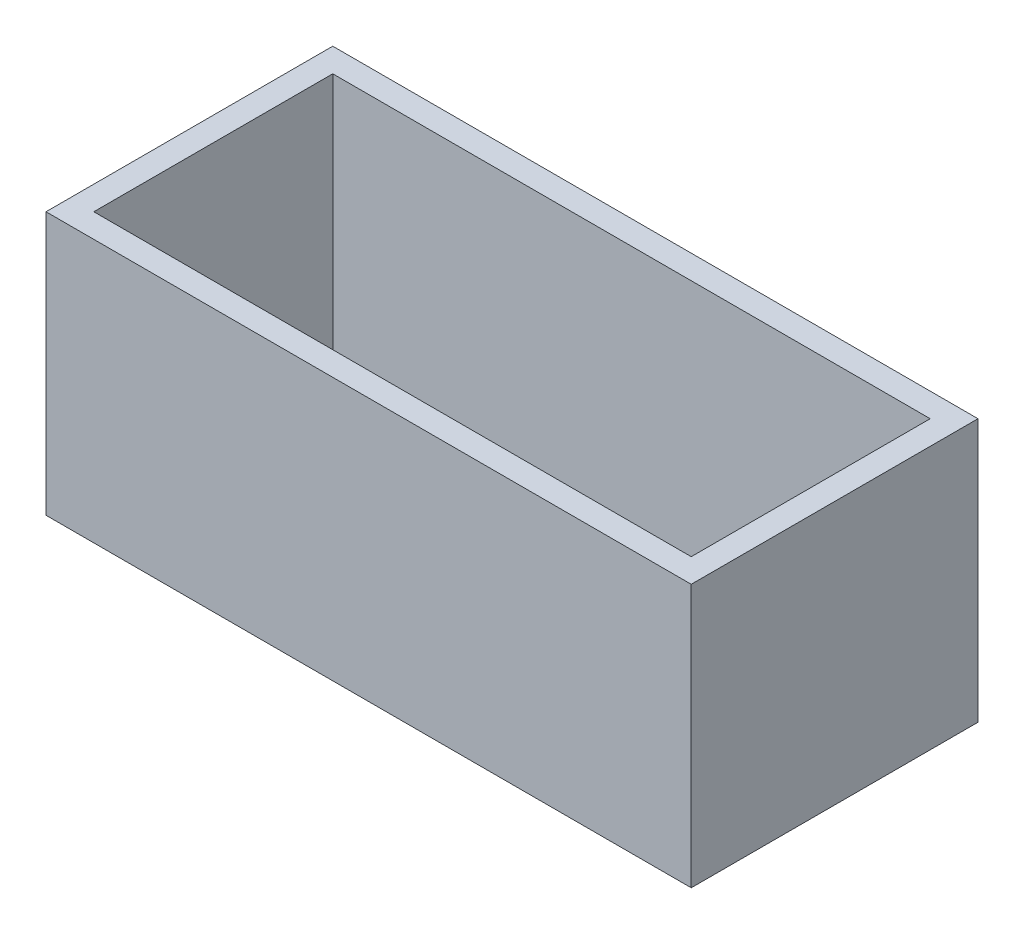
ISO-10303-21;
HEADER;
FILE_DESCRIPTION(('STEP AP214'),'2;1');
FILE_NAME('part.step','',(''),(''),'','','');
FILE_SCHEMA(('AUTOMOTIVE_DESIGN { 1 0 10303 214 1 1 1 1 }'));
ENDSEC;
DATA;
#1=APPLICATION_CONTEXT('core data for automotive mechanical design processes');
#2=APPLICATION_PROTOCOL_DEFINITION('international standard','automotive_design',2000,#1);
#3=PRODUCT_CONTEXT('',#1,'mechanical');
#4=PRODUCT('Part','Part','',(#3));
#5=PRODUCT_RELATED_PRODUCT_CATEGORY('part','',(#4));
#6=PRODUCT_DEFINITION_FORMATION('','',#4);
#7=PRODUCT_DEFINITION_CONTEXT('part definition',#1,'design');
#8=PRODUCT_DEFINITION('design','',#6,#7);
#9=PRODUCT_DEFINITION_SHAPE('','',#8);
#10=(LENGTH_UNIT() NAMED_UNIT(*) SI_UNIT(.MILLI.,.METRE.));
#11=(NAMED_UNIT(*) PLANE_ANGLE_UNIT() SI_UNIT($,.RADIAN.));
#12=(NAMED_UNIT(*) SI_UNIT($,.STERADIAN.) SOLID_ANGLE_UNIT());
#13=UNCERTAINTY_MEASURE_WITH_UNIT(LENGTH_MEASURE(1.E-05),#10,'distance_accuracy_value','');
#14=(GEOMETRIC_REPRESENTATION_CONTEXT(3) GLOBAL_UNCERTAINTY_ASSIGNED_CONTEXT((#13)) GLOBAL_UNIT_ASSIGNED_CONTEXT((#10,
#11,#12)) REPRESENTATION_CONTEXT('',''));
#15=CARTESIAN_POINT('',(0.,0.,0.));
#16=DIRECTION('',(0.,0.,1.));
#17=DIRECTION('',(1.,0.,0.));
#18=AXIS2_PLACEMENT_3D('',#15,#16,#17);
#19=CARTESIAN_POINT('',(0.,25.,0.));
#20=DIRECTION('',(0.,-1.,0.));
#21=DIRECTION('',(0.,0.,-1.));
#22=AXIS2_PLACEMENT_3D('',#19,#20,#21);
#23=PLANE('',#22);
#24=DIRECTION('',(0.,0.,-1.));
#25=VECTOR('',#24,1.);
#26=CARTESIAN_POINT('',(67.5,25.,30.));
#27=LINE('',#26,#25);
#28=CARTESIAN_POINT('',(67.5,25.,30.));
#29=VERTEX_POINT('',#28);
#30=CARTESIAN_POINT('',(67.5,25.,-30.));
#31=VERTEX_POINT('',#30);
#32=EDGE_CURVE('E174',#29,#31,#27,.T.);
#33=ORIENTED_EDGE('',*,*,#32,.T.);
#34=DIRECTION('',(-1.,0.,0.));
#35=VECTOR('',#34,1.);
#36=CARTESIAN_POINT('',(-67.5,25.,-30.));
#37=LINE('',#36,#35);
#38=CARTESIAN_POINT('',(-67.5,25.,-30.));
#39=VERTEX_POINT('',#38);
#40=EDGE_CURVE('E178',#31,#39,#37,.T.);
#41=ORIENTED_EDGE('',*,*,#40,.T.);
#42=DIRECTION('',(0.,0.,1.));
#43=VECTOR('',#42,1.);
#44=CARTESIAN_POINT('',(-67.5,25.,30.));
#45=LINE('',#44,#43);
#46=CARTESIAN_POINT('',(-67.5,25.,30.));
#47=VERTEX_POINT('',#46);
#48=EDGE_CURVE('E112',#39,#47,#45,.T.);
#49=ORIENTED_EDGE('',*,*,#48,.T.);
#50=DIRECTION('',(1.,0.,0.));
#51=VECTOR('',#50,1.);
#52=CARTESIAN_POINT('',(-67.5,25.,30.));
#53=LINE('',#52,#51);
#54=EDGE_CURVE('E183',#47,#29,#53,.T.);
#55=ORIENTED_EDGE('',*,*,#54,.T.);
#56=EDGE_LOOP('',(#33,#41,#49,#55));
#57=FACE_BOUND('',#56,.T.);
#58=DIRECTION('',(0.,0.,1.));
#59=VECTOR('',#58,1.);
#60=CARTESIAN_POINT('',(-62.5,25.,25.));
#61=LINE('',#60,#59);
#62=CARTESIAN_POINT('',(-62.5,25.,-25.));
#63=VERTEX_POINT('',#62);
#64=CARTESIAN_POINT('',(-62.5,25.,25.));
#65=VERTEX_POINT('',#64);
#66=EDGE_CURVE('E137',#63,#65,#61,.T.);
#67=ORIENTED_EDGE('',*,*,#66,.F.);
#68=DIRECTION('',(-1.,0.,0.));
#69=VECTOR('',#68,1.);
#70=CARTESIAN_POINT('',(-62.5,25.,-25.));
#71=LINE('',#70,#69);
#72=CARTESIAN_POINT('',(62.5,25.,-25.));
#73=VERTEX_POINT('',#72);
#74=EDGE_CURVE('E147',#73,#63,#71,.T.);
#75=ORIENTED_EDGE('',*,*,#74,.F.);
#76=DIRECTION('',(0.,0.,-1.));
#77=VECTOR('',#76,1.);
#78=CARTESIAN_POINT('',(62.5,25.,25.));
#79=LINE('',#78,#77);
#80=CARTESIAN_POINT('',(62.5,25.,25.));
#81=VERTEX_POINT('',#80);
#82=EDGE_CURVE('E144',#81,#73,#79,.T.);
#83=ORIENTED_EDGE('',*,*,#82,.F.);
#84=DIRECTION('',(1.,0.,0.));
#85=VECTOR('',#84,1.);
#86=CARTESIAN_POINT('',(-62.5,25.,25.));
#87=LINE('',#86,#85);
#88=EDGE_CURVE('E140',#65,#81,#87,.T.);
#89=ORIENTED_EDGE('',*,*,#88,.F.);
#90=EDGE_LOOP('',(#67,#75,#83,#89));
#91=FACE_BOUND('',#90,.T.);
#92=ADVANCED_FACE('F39',(#57,#91),#23,.F.);
#93=CARTESIAN_POINT('',(67.5,25.,30.));
#94=DIRECTION('',(-1.,0.,0.));
#95=DIRECTION('',(0.,0.,1.));
#96=AXIS2_PLACEMENT_3D('',#93,#94,#95);
#97=PLANE('',#96);
#98=DIRECTION('',(0.,-1.,0.));
#99=VECTOR('',#98,1.);
#100=CARTESIAN_POINT('',(67.5,25.,30.));
#101=LINE('',#100,#99);
#102=CARTESIAN_POINT('',(67.5,-30.,30.));
#103=VERTEX_POINT('',#102);
#104=EDGE_CURVE('E186',#29,#103,#101,.T.);
#105=ORIENTED_EDGE('',*,*,#104,.T.);
#106=DIRECTION('',(0.,0.,-1.));
#107=VECTOR('',#106,1.);
#108=CARTESIAN_POINT('',(67.5,-30.,-30.));
#109=LINE('',#108,#107);
#110=CARTESIAN_POINT('',(67.5,-30.,-30.));
#111=VERTEX_POINT('',#110);
#112=EDGE_CURVE('E133',#103,#111,#109,.T.);
#113=ORIENTED_EDGE('',*,*,#112,.T.);
#114=DIRECTION('',(0.,-1.,0.));
#115=VECTOR('',#114,1.);
#116=CARTESIAN_POINT('',(67.5,25.,-30.));
#117=LINE('',#116,#115);
#118=EDGE_CURVE('E11',#31,#111,#117,.T.);
#119=ORIENTED_EDGE('',*,*,#118,.F.);
#120=ORIENTED_EDGE('',*,*,#32,.F.);
#121=EDGE_LOOP('',(#105,#113,#119,#120));
#122=FACE_BOUND('',#121,.T.);
#123=ADVANCED_FACE('F41',(#122),#97,.F.);
#124=CARTESIAN_POINT('',(-67.5,25.,-30.));
#125=DIRECTION('',(0.,0.,1.));
#126=DIRECTION('',(1.,0.,0.));
#127=AXIS2_PLACEMENT_3D('',#124,#125,#126);
#128=PLANE('',#127);
#129=ORIENTED_EDGE('',*,*,#118,.T.);
#130=DIRECTION('',(-1.,0.,0.));
#131=VECTOR('',#130,1.);
#132=CARTESIAN_POINT('',(127.707972893962,-30.,-30.));
#133=LINE('',#132,#131);
#134=CARTESIAN_POINT('',(-67.5,-30.,-30.));
#135=VERTEX_POINT('',#134);
#136=EDGE_CURVE('E117',#111,#135,#133,.T.);
#137=ORIENTED_EDGE('',*,*,#136,.T.);
#138=DIRECTION('',(0.,-1.,0.));
#139=VECTOR('',#138,1.);
#140=CARTESIAN_POINT('',(-67.5,25.,-30.));
#141=LINE('',#140,#139);
#142=EDGE_CURVE('E48',#39,#135,#141,.T.);
#143=ORIENTED_EDGE('',*,*,#142,.F.);
#144=ORIENTED_EDGE('',*,*,#40,.F.);
#145=EDGE_LOOP('',(#129,#137,#143,#144));
#146=FACE_BOUND('',#145,.T.);
#147=ADVANCED_FACE('F118',(#146),#128,.F.);
#148=CARTESIAN_POINT('',(-67.5,25.,30.));
#149=DIRECTION('',(1.,0.,0.));
#150=DIRECTION('',(0.,0.,-1.));
#151=AXIS2_PLACEMENT_3D('',#148,#149,#150);
#152=PLANE('',#151);
#153=ORIENTED_EDGE('',*,*,#142,.T.);
#154=DIRECTION('',(0.,0.,1.));
#155=VECTOR('',#154,1.);
#156=CARTESIAN_POINT('',(-67.5,-30.,-30.));
#157=LINE('',#156,#155);
#158=CARTESIAN_POINT('',(-67.5,-30.,30.));
#159=VERTEX_POINT('',#158);
#160=EDGE_CURVE('E111',#135,#159,#157,.T.);
#161=ORIENTED_EDGE('',*,*,#160,.T.);
#162=DIRECTION('',(0.,-1.,0.));
#163=VECTOR('',#162,1.);
#164=CARTESIAN_POINT('',(-67.5,25.,30.));
#165=LINE('',#164,#163);
#166=EDGE_CURVE('E115',#47,#159,#165,.T.);
#167=ORIENTED_EDGE('',*,*,#166,.F.);
#168=ORIENTED_EDGE('',*,*,#48,.F.);
#169=EDGE_LOOP('',(#153,#161,#167,#168));
#170=FACE_BOUND('',#169,.T.);
#171=ADVANCED_FACE('F108',(#170),#152,.F.);
#172=CARTESIAN_POINT('',(-67.5,25.,30.));
#173=DIRECTION('',(0.,0.,-1.));
#174=DIRECTION('',(-1.,0.,0.));
#175=AXIS2_PLACEMENT_3D('',#172,#173,#174);
#176=PLANE('',#175);
#177=ORIENTED_EDGE('',*,*,#166,.T.);
#178=DIRECTION('',(-1.,0.,0.));
#179=VECTOR('',#178,1.);
#180=CARTESIAN_POINT('',(127.707972893962,-30.,30.));
#181=LINE('',#180,#179);
#182=EDGE_CURVE('E124',#103,#159,#181,.T.);
#183=ORIENTED_EDGE('',*,*,#182,.F.);
#184=ORIENTED_EDGE('',*,*,#104,.F.);
#185=ORIENTED_EDGE('',*,*,#54,.F.);
#186=EDGE_LOOP('',(#177,#183,#184,#185));
#187=FACE_BOUND('',#186,.T.);
#188=ADVANCED_FACE('F192',(#187),#176,.F.);
#189=CARTESIAN_POINT('',(-62.5,25.,25.));
#190=DIRECTION('',(1.,0.,0.));
#191=DIRECTION('',(0.,0.,-1.));
#192=AXIS2_PLACEMENT_3D('',#189,#190,#191);
#193=PLANE('',#192);
#194=DIRECTION('',(0.,0.,1.));
#195=VECTOR('',#194,1.);
#196=CARTESIAN_POINT('',(-62.5,-25.,25.));
#197=LINE('',#196,#195);
#198=CARTESIAN_POINT('',(-62.5,-25.,-25.));
#199=VERTEX_POINT('',#198);
#200=CARTESIAN_POINT('',(-62.5,-25.,25.));
#201=VERTEX_POINT('',#200);
#202=EDGE_CURVE('E63',#199,#201,#197,.T.);
#203=ORIENTED_EDGE('',*,*,#202,.F.);
#204=DIRECTION('',(0.,-1.,0.));
#205=VECTOR('',#204,1.);
#206=CARTESIAN_POINT('',(-62.5,25.,-25.));
#207=LINE('',#206,#205);
#208=EDGE_CURVE('E150',#63,#199,#207,.T.);
#209=ORIENTED_EDGE('',*,*,#208,.F.);
#210=ORIENTED_EDGE('',*,*,#66,.T.);
#211=DIRECTION('',(0.,-1.,0.));
#212=VECTOR('',#211,1.);
#213=CARTESIAN_POINT('',(-62.5,25.,25.));
#214=LINE('',#213,#212);
#215=EDGE_CURVE('E171',#65,#201,#214,.T.);
#216=ORIENTED_EDGE('',*,*,#215,.T.);
#217=EDGE_LOOP('',(#203,#209,#210,#216));
#218=FACE_BOUND('',#217,.T.);
#219=ADVANCED_FACE('F208',(#218),#193,.T.);
#220=CARTESIAN_POINT('',(-62.5,25.,25.));
#221=DIRECTION('',(0.,0.,-1.));
#222=DIRECTION('',(-1.,0.,0.));
#223=AXIS2_PLACEMENT_3D('',#220,#221,#222);
#224=PLANE('',#223);
#225=DIRECTION('',(1.,0.,0.));
#226=VECTOR('',#225,1.);
#227=CARTESIAN_POINT('',(-62.5,-25.,25.));
#228=LINE('',#227,#226);
#229=CARTESIAN_POINT('',(62.5,-25.,25.));
#230=VERTEX_POINT('',#229);
#231=EDGE_CURVE('E153',#201,#230,#228,.T.);
#232=ORIENTED_EDGE('',*,*,#231,.F.);
#233=ORIENTED_EDGE('',*,*,#215,.F.);
#234=ORIENTED_EDGE('',*,*,#88,.T.);
#235=DIRECTION('',(0.,-1.,0.));
#236=VECTOR('',#235,1.);
#237=CARTESIAN_POINT('',(62.5,25.,25.));
#238=LINE('',#237,#236);
#239=EDGE_CURVE('E168',#81,#230,#238,.T.);
#240=ORIENTED_EDGE('',*,*,#239,.T.);
#241=EDGE_LOOP('',(#232,#233,#234,#240));
#242=FACE_BOUND('',#241,.T.);
#243=ADVANCED_FACE('F227',(#242),#224,.T.);
#244=CARTESIAN_POINT('',(62.5,25.,25.));
#245=DIRECTION('',(-1.,0.,0.));
#246=DIRECTION('',(0.,0.,1.));
#247=AXIS2_PLACEMENT_3D('',#244,#245,#246);
#248=PLANE('',#247);
#249=DIRECTION('',(0.,0.,-1.));
#250=VECTOR('',#249,1.);
#251=CARTESIAN_POINT('',(62.5,-25.,25.));
#252=LINE('',#251,#250);
#253=CARTESIAN_POINT('',(62.5,-25.,-25.));
#254=VERTEX_POINT('',#253);
#255=EDGE_CURVE('E157',#230,#254,#252,.T.);
#256=ORIENTED_EDGE('',*,*,#255,.F.);
#257=ORIENTED_EDGE('',*,*,#239,.F.);
#258=ORIENTED_EDGE('',*,*,#82,.T.);
#259=DIRECTION('',(0.,-1.,0.));
#260=VECTOR('',#259,1.);
#261=CARTESIAN_POINT('',(62.5,25.,-25.));
#262=LINE('',#261,#260);
#263=EDGE_CURVE('E55',#73,#254,#262,.T.);
#264=ORIENTED_EDGE('',*,*,#263,.T.);
#265=EDGE_LOOP('',(#256,#257,#258,#264));
#266=FACE_BOUND('',#265,.T.);
#267=ADVANCED_FACE('F233',(#266),#248,.T.);
#268=CARTESIAN_POINT('',(-62.5,25.,-25.));
#269=DIRECTION('',(0.,0.,1.));
#270=DIRECTION('',(1.,0.,0.));
#271=AXIS2_PLACEMENT_3D('',#268,#269,#270);
#272=PLANE('',#271);
#273=DIRECTION('',(-1.,0.,0.));
#274=VECTOR('',#273,1.);
#275=CARTESIAN_POINT('',(-62.5,-25.,-25.));
#276=LINE('',#275,#274);
#277=EDGE_CURVE('E141',#254,#199,#276,.T.);
#278=ORIENTED_EDGE('',*,*,#277,.F.);
#279=ORIENTED_EDGE('',*,*,#263,.F.);
#280=ORIENTED_EDGE('',*,*,#74,.T.);
#281=ORIENTED_EDGE('',*,*,#208,.T.);
#282=EDGE_LOOP('',(#278,#279,#280,#281));
#283=FACE_BOUND('',#282,.T.);
#284=ADVANCED_FACE('F240',(#283),#272,.T.);
#285=CARTESIAN_POINT('',(127.707972893962,-25.,-30.));
#286=DIRECTION('',(0.,1.,0.));
#287=DIRECTION('',(0.,0.,1.));
#288=AXIS2_PLACEMENT_3D('',#285,#286,#287);
#289=PLANE('',#288);
#290=ORIENTED_EDGE('',*,*,#255,.T.);
#291=ORIENTED_EDGE('',*,*,#277,.T.);
#292=ORIENTED_EDGE('',*,*,#202,.T.);
#293=ORIENTED_EDGE('',*,*,#231,.T.);
#294=EDGE_LOOP('',(#290,#291,#292,#293));
#295=FACE_BOUND('',#294,.T.);
#296=ADVANCED_FACE('F248',(#295),#289,.T.);
#297=CARTESIAN_POINT('',(127.707972893962,-30.,-30.));
#298=DIRECTION('',(0.,-1.,0.));
#299=DIRECTION('',(0.,0.,-1.));
#300=AXIS2_PLACEMENT_3D('',#297,#298,#299);
#301=PLANE('',#300);
#302=ORIENTED_EDGE('',*,*,#112,.F.);
#303=ORIENTED_EDGE('',*,*,#182,.T.);
#304=ORIENTED_EDGE('',*,*,#160,.F.);
#305=ORIENTED_EDGE('',*,*,#136,.F.);
#306=EDGE_LOOP('',(#302,#303,#304,#305));
#307=FACE_BOUND('',#306,.T.);
#308=ADVANCED_FACE('F127',(#307),#301,.T.);
#309=CLOSED_SHELL('',(#92,#123,#147,#171,#188,#219,#243,#267,#284,#296,#308));
#310=MANIFOLD_SOLID_BREP('B2',#309);
#311=ADVANCED_BREP_SHAPE_REPRESENTATION('',(#18,#310),#14);
#312=SHAPE_DEFINITION_REPRESENTATION(#9,#311);
ENDSEC;
END-ISO-10303-21;
